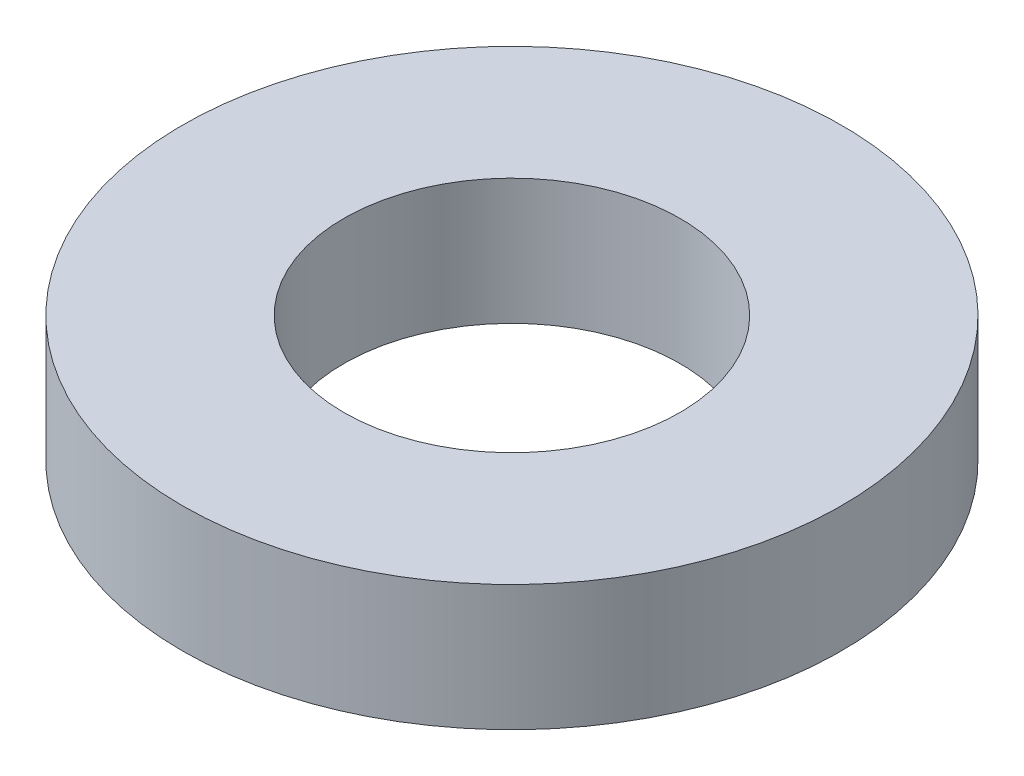
ISO-10303-21;
HEADER;
FILE_DESCRIPTION(('STEP AP214'),'2;1');
FILE_NAME('part.step','',(''),(''),'','','');
FILE_SCHEMA(('AUTOMOTIVE_DESIGN { 1 0 10303 214 1 1 1 1 }'));
ENDSEC;
DATA;
#1=APPLICATION_CONTEXT('core data for automotive mechanical design processes');
#2=APPLICATION_PROTOCOL_DEFINITION('international standard','automotive_design',2000,#1);
#3=PRODUCT_CONTEXT('',#1,'mechanical');
#4=PRODUCT('Part','Part','',(#3));
#5=PRODUCT_RELATED_PRODUCT_CATEGORY('part','',(#4));
#6=PRODUCT_DEFINITION_FORMATION('','',#4);
#7=PRODUCT_DEFINITION_CONTEXT('part definition',#1,'design');
#8=PRODUCT_DEFINITION('design','',#6,#7);
#9=PRODUCT_DEFINITION_SHAPE('','',#8);
#10=(LENGTH_UNIT() NAMED_UNIT(*) SI_UNIT(.MILLI.,.METRE.));
#11=(NAMED_UNIT(*) PLANE_ANGLE_UNIT() SI_UNIT($,.RADIAN.));
#12=(NAMED_UNIT(*) SI_UNIT($,.STERADIAN.) SOLID_ANGLE_UNIT());
#13=UNCERTAINTY_MEASURE_WITH_UNIT(LENGTH_MEASURE(1.E-05),#10,'distance_accuracy_value','');
#14=(GEOMETRIC_REPRESENTATION_CONTEXT(3) GLOBAL_UNCERTAINTY_ASSIGNED_CONTEXT((#13)) GLOBAL_UNIT_ASSIGNED_CONTEXT((#10,
#11,#12)) REPRESENTATION_CONTEXT('',''));
#15=CARTESIAN_POINT('',(0.,0.,0.));
#16=DIRECTION('',(0.,0.,1.));
#17=DIRECTION('',(1.,0.,0.));
#18=AXIS2_PLACEMENT_3D('',#15,#16,#17);
#19=CARTESIAN_POINT('',(0.,1.87,0.));
#20=DIRECTION('',(0.,1.,0.));
#21=DIRECTION('',(0.,0.,1.));
#22=AXIS2_PLACEMENT_3D('',#19,#20,#21);
#23=PLANE('',#22);
#24=CARTESIAN_POINT('',(0.,1.87,0.));
#25=DIRECTION('',(0.,1.,0.));
#26=DIRECTION('',(0.,0.,1.));
#27=AXIS2_PLACEMENT_3D('',#24,#25,#26);
#28=CIRCLE('',#27,4.9);
#29=CARTESIAN_POINT('',(0.,1.87,4.9));
#30=VERTEX_POINT('',#29);
#31=EDGE_CURVE('E10',#30,#30,#28,.T.);
#32=ORIENTED_EDGE('',*,*,#31,.T.);
#33=EDGE_LOOP('',(#32));
#34=FACE_BOUND('',#33,.T.);
#35=CARTESIAN_POINT('',(0.,1.87,0.));
#36=DIRECTION('',(0.,1.,0.));
#37=DIRECTION('',(0.,0.,1.));
#38=AXIS2_PLACEMENT_3D('',#35,#36,#37);
#39=CIRCLE('',#38,2.5);
#40=CARTESIAN_POINT('',(0.,1.87,2.5));
#41=VERTEX_POINT('',#40);
#42=EDGE_CURVE('E46',#41,#41,#39,.T.);
#43=ORIENTED_EDGE('',*,*,#42,.F.);
#44=EDGE_LOOP('',(#43));
#45=FACE_BOUND('',#44,.T.);
#46=ADVANCED_FACE('F35',(#34,#45),#23,.T.);
#47=CARTESIAN_POINT('',(0.,0.,0.));
#48=DIRECTION('',(0.,1.,0.));
#49=DIRECTION('',(0.,0.,1.));
#50=AXIS2_PLACEMENT_3D('',#47,#48,#49);
#51=PLANE('',#50);
#52=CARTESIAN_POINT('',(0.,0.,0.));
#53=DIRECTION('',(0.,1.,0.));
#54=DIRECTION('',(0.,0.,1.));
#55=AXIS2_PLACEMENT_3D('',#52,#53,#54);
#56=CIRCLE('',#55,4.9);
#57=CARTESIAN_POINT('',(0.,0.,4.9));
#58=VERTEX_POINT('',#57);
#59=EDGE_CURVE('E39',#58,#58,#56,.T.);
#60=ORIENTED_EDGE('',*,*,#59,.F.);
#61=EDGE_LOOP('',(#60));
#62=FACE_BOUND('',#61,.T.);
#63=CARTESIAN_POINT('',(0.,0.,0.));
#64=DIRECTION('',(0.,1.,0.));
#65=DIRECTION('',(0.,0.,1.));
#66=AXIS2_PLACEMENT_3D('',#63,#64,#65);
#67=CIRCLE('',#66,2.5);
#68=CARTESIAN_POINT('',(0.,0.,2.5));
#69=VERTEX_POINT('',#68);
#70=EDGE_CURVE('E48',#69,#69,#67,.T.);
#71=ORIENTED_EDGE('',*,*,#70,.T.);
#72=EDGE_LOOP('',(#71));
#73=FACE_BOUND('',#72,.T.);
#74=ADVANCED_FACE('F58',(#62,#73),#51,.F.);
#75=CARTESIAN_POINT('',(0.,1.87,0.));
#76=DIRECTION('',(0.,-1.,0.));
#77=DIRECTION('',(0.,0.,-1.));
#78=AXIS2_PLACEMENT_3D('',#75,#76,#77);
#79=CYLINDRICAL_SURFACE('',#78,4.9);
#80=ORIENTED_EDGE('',*,*,#31,.F.);
#81=EDGE_LOOP('',(#80));
#82=FACE_BOUND('',#81,.T.);
#83=ORIENTED_EDGE('',*,*,#59,.T.);
#84=EDGE_LOOP('',(#83));
#85=FACE_BOUND('',#84,.T.);
#86=ADVANCED_FACE('F37',(#82,#85),#79,.T.);
#87=CARTESIAN_POINT('',(0.,1.87,0.));
#88=DIRECTION('',(0.,-1.,0.));
#89=DIRECTION('',(0.,0.,-1.));
#90=AXIS2_PLACEMENT_3D('',#87,#88,#89);
#91=CYLINDRICAL_SURFACE('',#90,2.5);
#92=ORIENTED_EDGE('',*,*,#42,.T.);
#93=EDGE_LOOP('',(#92));
#94=FACE_BOUND('',#93,.T.);
#95=ORIENTED_EDGE('',*,*,#70,.F.);
#96=EDGE_LOOP('',(#95));
#97=FACE_BOUND('',#96,.T.);
#98=ADVANCED_FACE('F54',(#94,#97),#91,.F.);
#99=CLOSED_SHELL('',(#46,#74,#86,#98));
#100=MANIFOLD_SOLID_BREP('B2',#99);
#101=ADVANCED_BREP_SHAPE_REPRESENTATION('',(#18,#100),#14);
#102=SHAPE_DEFINITION_REPRESENTATION(#9,#101);
ENDSEC;
END-ISO-10303-21;
